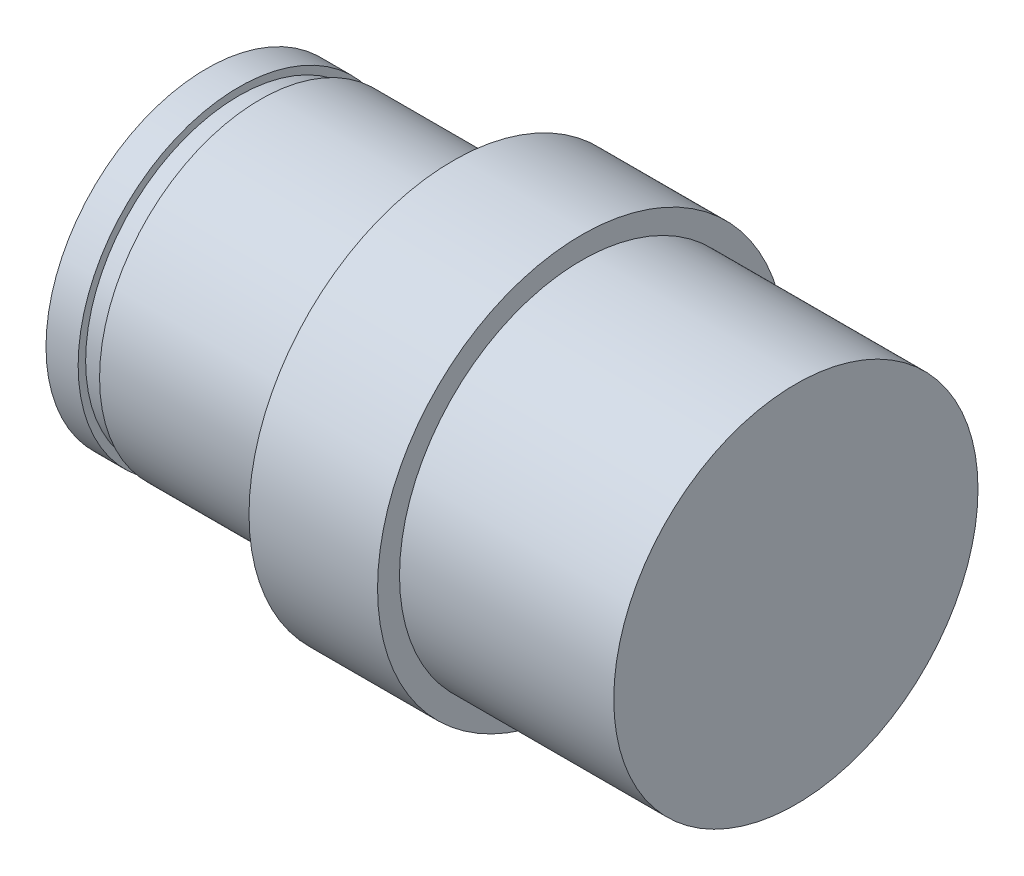
ISO-10303-21;
HEADER;
FILE_DESCRIPTION(('STEP AP214'),'2;1');
FILE_NAME('part.step','',(''),(''),'','','');
FILE_SCHEMA(('AUTOMOTIVE_DESIGN { 1 0 10303 214 1 1 1 1 }'));
ENDSEC;
DATA;
#1=APPLICATION_CONTEXT('core data for automotive mechanical design processes');
#2=APPLICATION_PROTOCOL_DEFINITION('international standard','automotive_design',2000,#1);
#3=PRODUCT_CONTEXT('',#1,'mechanical');
#4=PRODUCT('Part','Part','',(#3));
#5=PRODUCT_RELATED_PRODUCT_CATEGORY('part','',(#4));
#6=PRODUCT_DEFINITION_FORMATION('','',#4);
#7=PRODUCT_DEFINITION_CONTEXT('part definition',#1,'design');
#8=PRODUCT_DEFINITION('design','',#6,#7);
#9=PRODUCT_DEFINITION_SHAPE('','',#8);
#10=(LENGTH_UNIT() NAMED_UNIT(*) SI_UNIT(.MILLI.,.METRE.));
#11=(NAMED_UNIT(*) PLANE_ANGLE_UNIT() SI_UNIT($,.RADIAN.));
#12=(NAMED_UNIT(*) SI_UNIT($,.STERADIAN.) SOLID_ANGLE_UNIT());
#13=UNCERTAINTY_MEASURE_WITH_UNIT(LENGTH_MEASURE(1.E-05),#10,'distance_accuracy_value','');
#14=(GEOMETRIC_REPRESENTATION_CONTEXT(3) GLOBAL_UNCERTAINTY_ASSIGNED_CONTEXT((#13)) GLOBAL_UNIT_ASSIGNED_CONTEXT((#10,
#11,#12)) REPRESENTATION_CONTEXT('',''));
#15=CARTESIAN_POINT('',(0.,0.,0.));
#16=DIRECTION('',(0.,0.,1.));
#17=DIRECTION('',(1.,0.,0.));
#18=AXIS2_PLACEMENT_3D('',#15,#16,#17);
#19=CARTESIAN_POINT('',(0.,0.,0.));
#20=DIRECTION('',(-0.999999999999999,0.,0.));
#21=DIRECTION('',(0.,0.,1.));
#22=AXIS2_PLACEMENT_3D('',#19,#20,#21);
#23=CYLINDRICAL_SURFACE('',#22,7.5);
#24=CARTESIAN_POINT('',(11.5,0.,0.));
#25=DIRECTION('',(-0.999999999999999,0.,0.));
#26=DIRECTION('',(0.,0.,1.));
#27=AXIS2_PLACEMENT_3D('',#24,#25,#26);
#28=CIRCLE('',#27,7.5);
#29=CARTESIAN_POINT('',(11.5,0.,7.5));
#30=VERTEX_POINT('',#29);
#31=EDGE_CURVE('E37',#30,#30,#28,.T.);
#32=CARTESIAN_POINT('',(2.5,0.,0.));
#33=DIRECTION('',(-0.999999999999999,0.,0.));
#34=DIRECTION('',(0.,0.,1.));
#35=AXIS2_PLACEMENT_3D('',#32,#33,#34);
#36=CIRCLE('',#35,7.5);
#37=CARTESIAN_POINT('',(2.5,0.,7.5));
#38=VERTEX_POINT('',#37);
#39=EDGE_CURVE('E62',#38,#38,#36,.T.);
#40=CARTESIAN_POINT('',(11.5,0.,7.5));
#41=CARTESIAN_POINT('',(11.40625,0.,7.5));
#42=CARTESIAN_POINT('',(11.3125,0.,7.5));
#43=CARTESIAN_POINT('',(11.125,0.,7.5));
#44=CARTESIAN_POINT('',(11.03125,0.,7.5));
#45=CARTESIAN_POINT('',(10.84375,0.,7.5));
#46=CARTESIAN_POINT('',(10.75,0.,7.5));
#47=CARTESIAN_POINT('',(10.5625,0.,7.5));
#48=CARTESIAN_POINT('',(10.46875,0.,7.5));
#49=CARTESIAN_POINT('',(10.28125,0.,7.5));
#50=CARTESIAN_POINT('',(10.1875,0.,7.5));
#51=CARTESIAN_POINT('',(10.,0.,7.5));
#52=CARTESIAN_POINT('',(9.90625000000001,0.,7.5));
#53=CARTESIAN_POINT('',(9.71875000000001,0.,7.5));
#54=CARTESIAN_POINT('',(9.62500000000001,0.,7.5));
#55=CARTESIAN_POINT('',(9.43750000000001,0.,7.5));
#56=CARTESIAN_POINT('',(9.34375000000001,0.,7.5));
#57=CARTESIAN_POINT('',(9.15625000000001,0.,7.5));
#58=CARTESIAN_POINT('',(9.06250000000001,0.,7.5));
#59=CARTESIAN_POINT('',(8.87500000000001,0.,7.5));
#60=CARTESIAN_POINT('',(8.78125000000001,0.,7.5));
#61=CARTESIAN_POINT('',(8.59375000000001,0.,7.5));
#62=CARTESIAN_POINT('',(8.50000000000001,0.,7.5));
#63=CARTESIAN_POINT('',(8.31250000000001,0.,7.5));
#64=CARTESIAN_POINT('',(8.21875000000001,0.,7.5));
#65=CARTESIAN_POINT('',(8.03125000000001,0.,7.5));
#66=CARTESIAN_POINT('',(7.93750000000001,0.,7.5));
#67=CARTESIAN_POINT('',(7.75000000000001,0.,7.5));
#68=CARTESIAN_POINT('',(7.65625000000001,0.,7.5));
#69=CARTESIAN_POINT('',(7.46875000000001,0.,7.5));
#70=CARTESIAN_POINT('',(7.37500000000001,0.,7.5));
#71=CARTESIAN_POINT('',(7.18750000000001,0.,7.5));
#72=CARTESIAN_POINT('',(7.09375000000001,0.,7.5));
#73=CARTESIAN_POINT('',(6.90625000000001,0.,7.5));
#74=CARTESIAN_POINT('',(6.81250000000001,0.,7.5));
#75=CARTESIAN_POINT('',(6.62500000000001,0.,7.5));
#76=CARTESIAN_POINT('',(6.53125000000001,0.,7.5));
#77=CARTESIAN_POINT('',(6.34375000000001,0.,7.5));
#78=CARTESIAN_POINT('',(6.25,0.,7.5));
#79=CARTESIAN_POINT('',(6.0625,0.,7.5));
#80=CARTESIAN_POINT('',(5.96875,0.,7.5));
#81=CARTESIAN_POINT('',(5.78125,0.,7.5));
#82=CARTESIAN_POINT('',(5.68750000000001,0.,7.5));
#83=CARTESIAN_POINT('',(5.50000000000001,0.,7.5));
#84=CARTESIAN_POINT('',(5.40625,0.,7.5));
#85=CARTESIAN_POINT('',(5.21875,0.,7.5));
#86=CARTESIAN_POINT('',(5.125,0.,7.5));
#87=CARTESIAN_POINT('',(4.9375,0.,7.5));
#88=CARTESIAN_POINT('',(4.84375,0.,7.5));
#89=CARTESIAN_POINT('',(4.65625,0.,7.5));
#90=CARTESIAN_POINT('',(4.5625,0.,7.5));
#91=CARTESIAN_POINT('',(4.375,0.,7.5));
#92=CARTESIAN_POINT('',(4.28125,0.,7.5));
#93=CARTESIAN_POINT('',(4.09375,0.,7.5));
#94=CARTESIAN_POINT('',(4.,0.,7.5));
#95=CARTESIAN_POINT('',(3.8125,0.,7.5));
#96=CARTESIAN_POINT('',(3.71875,0.,7.5));
#97=CARTESIAN_POINT('',(3.53125,0.,7.5));
#98=CARTESIAN_POINT('',(3.4375,0.,7.5));
#99=CARTESIAN_POINT('',(3.25,0.,7.5));
#100=CARTESIAN_POINT('',(3.15625,0.,7.5));
#101=CARTESIAN_POINT('',(2.96875,0.,7.5));
#102=CARTESIAN_POINT('',(2.875,0.,7.5));
#103=CARTESIAN_POINT('',(2.6875,0.,7.5));
#104=CARTESIAN_POINT('',(2.59375,0.,7.5));
#105=CARTESIAN_POINT('',(2.5,0.,7.5));
#106=B_SPLINE_CURVE_WITH_KNOTS('',3,(#40,#41,#42,#43,#44,#45,#46,#47,#48,#49,#50,#51,#52,#53,
#54,#55,#56,#57,#58,#59,#60,#61,#62,#63,#64,#65,#66,#67,#68,#69,#70,#71,#72,#73,#74,#75,#76,#77,
#78,#79,#80,#81,#82,#83,#84,#85,#86,#87,#88,#89,#90,#91,#92,#93,#94,#95,#96,#97,#98,#99,#100,
#101,#102,#103,#104,#105),.UNSPECIFIED.,.F.,.F.,(4,2,2,2,2,2,2,2,2,2,2,2,2,2,2,2,2,2,2,2,2,2,2,
2,2,2,2,2,2,2,2,2,4),(0.,0.28125,0.5625,0.843750000000001,1.125,1.40625,1.6875,1.96875,2.25,
2.53125,2.8125,3.09375,3.375,3.65625,3.9375,4.21875,4.5,4.78125,5.0625,5.34375000000001,
5.62500000000001,5.90625000000001,6.18750000000001,6.46875000000001,6.75000000000001,
7.03125000000001,7.31250000000001,7.59375000000001,7.87500000000001,8.15625000000001,
8.43750000000001,8.71875000000001,9.00000000000001),.UNSPECIFIED.);
#107=EDGE_CURVE('BSEAM30',#30,#38,#106,.T.);
#108=ORIENTED_EDGE('',*,*,#31,.T.);
#109=ORIENTED_EDGE('',*,*,#39,.F.);
#110=ORIENTED_EDGE('',*,*,#107,.T.);
#111=ORIENTED_EDGE('',*,*,#107,.F.);
#112=EDGE_LOOP('',(#108,#110,#109,#111));
#113=FACE_BOUND('',#112,.T.);
#114=ADVANCED_FACE('F30',(#113),#23,.T.);
#115=CARTESIAN_POINT('',(11.5,7.5,0.));
#116=DIRECTION('',(0.999999999999999,0.,0.));
#117=DIRECTION('',(0.,0.,-1.));
#118=AXIS2_PLACEMENT_3D('',#115,#116,#117);
#119=PLANE('',#118);
#120=ORIENTED_EDGE('',*,*,#31,.F.);
#121=EDGE_LOOP('',(#120));
#122=FACE_BOUND('',#121,.T.);
#123=CARTESIAN_POINT('',(11.5,0.,0.));
#124=DIRECTION('',(-0.999999999999999,0.,0.));
#125=DIRECTION('',(0.,0.,1.));
#126=AXIS2_PLACEMENT_3D('',#123,#124,#125);
#127=CIRCLE('',#126,9.525);
#128=CARTESIAN_POINT('',(11.5,0.,9.525));
#129=VERTEX_POINT('',#128);
#130=EDGE_CURVE('E41',#129,#129,#127,.T.);
#131=ORIENTED_EDGE('',*,*,#130,.T.);
#132=EDGE_LOOP('',(#131));
#133=FACE_BOUND('',#132,.T.);
#134=ADVANCED_FACE('F88',(#122,#133),#119,.F.);
#135=CARTESIAN_POINT('',(0.,0.,0.));
#136=DIRECTION('',(-0.999999999999999,0.,0.));
#137=DIRECTION('',(0.,0.,1.));
#138=AXIS2_PLACEMENT_3D('',#135,#136,#137);
#139=CYLINDRICAL_SURFACE('',#138,9.525);
#140=CARTESIAN_POINT('',(17.5,0.,0.));
#141=DIRECTION('',(-0.999999999999999,0.,0.));
#142=DIRECTION('',(0.,0.,1.));
#143=AXIS2_PLACEMENT_3D('',#140,#141,#142);
#144=CIRCLE('',#143,9.525);
#145=CARTESIAN_POINT('',(17.5,0.,9.525));
#146=VERTEX_POINT('',#145);
#147=EDGE_CURVE('E45',#146,#146,#144,.T.);
#148=CARTESIAN_POINT('',(11.5,0.,9.525));
#149=CARTESIAN_POINT('',(11.5625,0.,9.525));
#150=CARTESIAN_POINT('',(11.625,0.,9.525));
#151=CARTESIAN_POINT('',(11.75,0.,9.525));
#152=CARTESIAN_POINT('',(11.8125,0.,9.525));
#153=CARTESIAN_POINT('',(11.9375,0.,9.525));
#154=CARTESIAN_POINT('',(12.,0.,9.525));
#155=CARTESIAN_POINT('',(12.125,0.,9.525));
#156=CARTESIAN_POINT('',(12.1875,0.,9.525));
#157=CARTESIAN_POINT('',(12.3125,0.,9.525));
#158=CARTESIAN_POINT('',(12.375,0.,9.525));
#159=CARTESIAN_POINT('',(12.5,0.,9.525));
#160=CARTESIAN_POINT('',(12.5625,0.,9.525));
#161=CARTESIAN_POINT('',(12.6875,0.,9.525));
#162=CARTESIAN_POINT('',(12.75,0.,9.525));
#163=CARTESIAN_POINT('',(12.875,0.,9.525));
#164=CARTESIAN_POINT('',(12.9375,0.,9.525));
#165=CARTESIAN_POINT('',(13.0625,0.,9.525));
#166=CARTESIAN_POINT('',(13.125,0.,9.525));
#167=CARTESIAN_POINT('',(13.25,0.,9.525));
#168=CARTESIAN_POINT('',(13.3125,0.,9.525));
#169=CARTESIAN_POINT('',(13.4375,0.,9.525));
#170=CARTESIAN_POINT('',(13.5,0.,9.525));
#171=CARTESIAN_POINT('',(13.625,0.,9.525));
#172=CARTESIAN_POINT('',(13.6875,0.,9.525));
#173=CARTESIAN_POINT('',(13.8125,0.,9.525));
#174=CARTESIAN_POINT('',(13.875,0.,9.525));
#175=CARTESIAN_POINT('',(14.,0.,9.525));
#176=CARTESIAN_POINT('',(14.0625,0.,9.525));
#177=CARTESIAN_POINT('',(14.1875,0.,9.525));
#178=CARTESIAN_POINT('',(14.25,0.,9.525));
#179=CARTESIAN_POINT('',(14.375,0.,9.525));
#180=CARTESIAN_POINT('',(14.4375,0.,9.525));
#181=CARTESIAN_POINT('',(14.5625,0.,9.525));
#182=CARTESIAN_POINT('',(14.625,0.,9.525));
#183=CARTESIAN_POINT('',(14.75,0.,9.525));
#184=CARTESIAN_POINT('',(14.8125,0.,9.525));
#185=CARTESIAN_POINT('',(14.9375,0.,9.525));
#186=CARTESIAN_POINT('',(15.,0.,9.525));
#187=CARTESIAN_POINT('',(15.125,0.,9.525));
#188=CARTESIAN_POINT('',(15.1875,0.,9.525));
#189=CARTESIAN_POINT('',(15.3125,0.,9.525));
#190=CARTESIAN_POINT('',(15.375,0.,9.525));
#191=CARTESIAN_POINT('',(15.5,0.,9.525));
#192=CARTESIAN_POINT('',(15.5625,0.,9.525));
#193=CARTESIAN_POINT('',(15.6875,0.,9.525));
#194=CARTESIAN_POINT('',(15.75,0.,9.525));
#195=CARTESIAN_POINT('',(15.875,0.,9.525));
#196=CARTESIAN_POINT('',(15.9375,0.,9.525));
#197=CARTESIAN_POINT('',(16.0625,0.,9.525));
#198=CARTESIAN_POINT('',(16.125,0.,9.525));
#199=CARTESIAN_POINT('',(16.25,0.,9.525));
#200=CARTESIAN_POINT('',(16.3125,0.,9.525));
#201=CARTESIAN_POINT('',(16.4375,0.,9.525));
#202=CARTESIAN_POINT('',(16.5,0.,9.525));
#203=CARTESIAN_POINT('',(16.625,0.,9.525));
#204=CARTESIAN_POINT('',(16.6875,0.,9.525));
#205=CARTESIAN_POINT('',(16.8125,0.,9.525));
#206=CARTESIAN_POINT('',(16.875,0.,9.525));
#207=CARTESIAN_POINT('',(17.,0.,9.525));
#208=CARTESIAN_POINT('',(17.0625,0.,9.525));
#209=CARTESIAN_POINT('',(17.1875,0.,9.525));
#210=CARTESIAN_POINT('',(17.25,0.,9.525));
#211=CARTESIAN_POINT('',(17.375,0.,9.525));
#212=CARTESIAN_POINT('',(17.4375,0.,9.525));
#213=CARTESIAN_POINT('',(17.5,0.,9.525));
#214=B_SPLINE_CURVE_WITH_KNOTS('',3,(#148,#149,#150,#151,#152,#153,#154,#155,#156,#157,#158,
#159,#160,#161,#162,#163,#164,#165,#166,#167,#168,#169,#170,#171,#172,#173,#174,#175,#176,#177,
#178,#179,#180,#181,#182,#183,#184,#185,#186,#187,#188,#189,#190,#191,#192,#193,#194,#195,#196,
#197,#198,#199,#200,#201,#202,#203,#204,#205,#206,#207,#208,#209,#210,#211,#212,#213),
.UNSPECIFIED.,.F.,.F.,(4,2,2,2,2,2,2,2,2,2,2,2,2,2,2,2,2,2,2,2,2,2,2,2,2,2,2,2,2,2,2,2,4),(0.,
0.1875,0.374999999999999,0.562499999999999,0.749999999999999,0.937499999999999,1.125,1.3125,1.5,
1.6875,1.875,2.0625,2.25,2.4375,2.625,2.8125,3.,3.1875,3.375,3.5625,3.75,3.9375,4.125,4.3125,
4.5,4.6875,4.875,5.0625,5.25,5.4375,5.625,5.8125,6.),.UNSPECIFIED.);
#215=EDGE_CURVE('BSEAM92',#129,#146,#214,.T.);
#216=ORIENTED_EDGE('',*,*,#130,.F.);
#217=ORIENTED_EDGE('',*,*,#147,.T.);
#218=ORIENTED_EDGE('',*,*,#215,.T.);
#219=ORIENTED_EDGE('',*,*,#215,.F.);
#220=EDGE_LOOP('',(#216,#218,#217,#219));
#221=FACE_BOUND('',#220,.T.);
#222=ADVANCED_FACE('F92',(#221),#139,.T.);
#223=CARTESIAN_POINT('',(17.5,9.525,0.));
#224=DIRECTION('',(-0.999999999999999,0.,0.));
#225=DIRECTION('',(0.,0.,1.));
#226=AXIS2_PLACEMENT_3D('',#223,#224,#225);
#227=PLANE('',#226);
#228=ORIENTED_EDGE('',*,*,#147,.F.);
#229=EDGE_LOOP('',(#228));
#230=FACE_BOUND('',#229,.T.);
#231=CARTESIAN_POINT('',(17.5,0.,0.));
#232=DIRECTION('',(-0.999999999999999,0.,0.));
#233=DIRECTION('',(0.,0.,1.));
#234=AXIS2_PLACEMENT_3D('',#231,#232,#233);
#235=CIRCLE('',#234,8.5);
#236=CARTESIAN_POINT('',(17.5,0.,8.5));
#237=VERTEX_POINT('',#236);
#238=EDGE_CURVE('E50',#237,#237,#235,.T.);
#239=ORIENTED_EDGE('',*,*,#238,.T.);
#240=EDGE_LOOP('',(#239));
#241=FACE_BOUND('',#240,.T.);
#242=ADVANCED_FACE('F138',(#230,#241),#227,.F.);
#243=CARTESIAN_POINT('',(0.,0.,0.));
#244=DIRECTION('',(-0.999999999999999,0.,0.));
#245=DIRECTION('',(0.,0.,1.));
#246=AXIS2_PLACEMENT_3D('',#243,#244,#245);
#247=CYLINDRICAL_SURFACE('',#246,8.5);
#248=CARTESIAN_POINT('',(27.5,0.,0.));
#249=DIRECTION('',(-0.999999999999999,0.,0.));
#250=DIRECTION('',(0.,0.,1.));
#251=AXIS2_PLACEMENT_3D('',#248,#249,#250);
#252=CIRCLE('',#251,8.5);
#253=CARTESIAN_POINT('',(27.5,0.,8.5));
#254=VERTEX_POINT('',#253);
#255=EDGE_CURVE('E53',#254,#254,#252,.T.);
#256=CARTESIAN_POINT('',(17.5,0.,8.5));
#257=CARTESIAN_POINT('',(17.6041666666667,0.,8.5));
#258=CARTESIAN_POINT('',(17.7083333333333,0.,8.5));
#259=CARTESIAN_POINT('',(17.9166666666667,0.,8.5));
#260=CARTESIAN_POINT('',(18.0208333333333,0.,8.5));
#261=CARTESIAN_POINT('',(18.2291666666667,0.,8.5));
#262=CARTESIAN_POINT('',(18.3333333333333,0.,8.5));
#263=CARTESIAN_POINT('',(18.5416666666667,0.,8.5));
#264=CARTESIAN_POINT('',(18.6458333333333,0.,8.5));
#265=CARTESIAN_POINT('',(18.8541666666667,0.,8.5));
#266=CARTESIAN_POINT('',(18.9583333333333,0.,8.5));
#267=CARTESIAN_POINT('',(19.1666666666667,0.,8.5));
#268=CARTESIAN_POINT('',(19.2708333333333,0.,8.5));
#269=CARTESIAN_POINT('',(19.4791666666667,0.,8.5));
#270=CARTESIAN_POINT('',(19.5833333333333,0.,8.5));
#271=CARTESIAN_POINT('',(19.7916666666667,0.,8.5));
#272=CARTESIAN_POINT('',(19.8958333333333,0.,8.5));
#273=CARTESIAN_POINT('',(20.1041666666667,0.,8.5));
#274=CARTESIAN_POINT('',(20.2083333333333,0.,8.5));
#275=CARTESIAN_POINT('',(20.4166666666667,0.,8.5));
#276=CARTESIAN_POINT('',(20.5208333333333,0.,8.5));
#277=CARTESIAN_POINT('',(20.7291666666667,0.,8.5));
#278=CARTESIAN_POINT('',(20.8333333333333,0.,8.5));
#279=CARTESIAN_POINT('',(21.0416666666667,0.,8.5));
#280=CARTESIAN_POINT('',(21.1458333333333,0.,8.5));
#281=CARTESIAN_POINT('',(21.3541666666667,0.,8.5));
#282=CARTESIAN_POINT('',(21.4583333333333,0.,8.5));
#283=CARTESIAN_POINT('',(21.6666666666667,0.,8.5));
#284=CARTESIAN_POINT('',(21.7708333333333,0.,8.5));
#285=CARTESIAN_POINT('',(21.9791666666667,0.,8.5));
#286=CARTESIAN_POINT('',(22.0833333333333,0.,8.5));
#287=CARTESIAN_POINT('',(22.2916666666667,0.,8.5));
#288=CARTESIAN_POINT('',(22.3958333333333,0.,8.5));
#289=CARTESIAN_POINT('',(22.6041666666667,0.,8.5));
#290=CARTESIAN_POINT('',(22.7083333333333,0.,8.5));
#291=CARTESIAN_POINT('',(22.9166666666667,0.,8.5));
#292=CARTESIAN_POINT('',(23.0208333333333,0.,8.5));
#293=CARTESIAN_POINT('',(23.2291666666667,0.,8.5));
#294=CARTESIAN_POINT('',(23.3333333333333,0.,8.5));
#295=CARTESIAN_POINT('',(23.5416666666667,0.,8.5));
#296=CARTESIAN_POINT('',(23.6458333333333,0.,8.5));
#297=CARTESIAN_POINT('',(23.8541666666667,0.,8.5));
#298=CARTESIAN_POINT('',(23.9583333333333,0.,8.5));
#299=CARTESIAN_POINT('',(24.1666666666667,0.,8.5));
#300=CARTESIAN_POINT('',(24.2708333333333,0.,8.5));
#301=CARTESIAN_POINT('',(24.4791666666667,0.,8.5));
#302=CARTESIAN_POINT('',(24.5833333333334,0.,8.5));
#303=CARTESIAN_POINT('',(24.7916666666667,0.,8.5));
#304=CARTESIAN_POINT('',(24.8958333333334,0.,8.5));
#305=CARTESIAN_POINT('',(25.1041666666667,0.,8.5));
#306=CARTESIAN_POINT('',(25.2083333333334,0.,8.5));
#307=CARTESIAN_POINT('',(25.4166666666667,0.,8.5));
#308=CARTESIAN_POINT('',(25.5208333333334,0.,8.5));
#309=CARTESIAN_POINT('',(25.7291666666667,0.,8.5));
#310=CARTESIAN_POINT('',(25.8333333333334,0.,8.5));
#311=CARTESIAN_POINT('',(26.0416666666667,0.,8.5));
#312=CARTESIAN_POINT('',(26.1458333333334,0.,8.5));
#313=CARTESIAN_POINT('',(26.3541666666667,0.,8.5));
#314=CARTESIAN_POINT('',(26.4583333333334,0.,8.5));
#315=CARTESIAN_POINT('',(26.6666666666667,0.,8.5));
#316=CARTESIAN_POINT('',(26.7708333333334,0.,8.5));
#317=CARTESIAN_POINT('',(26.9791666666667,0.,8.5));
#318=CARTESIAN_POINT('',(27.0833333333334,0.,8.5));
#319=CARTESIAN_POINT('',(27.2916666666667,0.,8.5));
#320=CARTESIAN_POINT('',(27.3958333333334,0.,8.5));
#321=CARTESIAN_POINT('',(27.5,0.,8.5));
#322=B_SPLINE_CURVE_WITH_KNOTS('',3,(#256,#257,#258,#259,#260,#261,#262,#263,#264,#265,#266,
#267,#268,#269,#270,#271,#272,#273,#274,#275,#276,#277,#278,#279,#280,#281,#282,#283,#284,#285,
#286,#287,#288,#289,#290,#291,#292,#293,#294,#295,#296,#297,#298,#299,#300,#301,#302,#303,#304,
#305,#306,#307,#308,#309,#310,#311,#312,#313,#314,#315,#316,#317,#318,#319,#320,#321),
.UNSPECIFIED.,.F.,.F.,(4,2,2,2,2,2,2,2,2,2,2,2,2,2,2,2,2,2,2,2,2,2,2,2,2,2,2,2,2,2,2,2,4),(0.,
0.3125,0.625000000000001,0.937499999999997,1.25,1.5625,1.875,2.1875,2.5,2.8125,3.125,3.4375,
3.75,4.0625,4.375,4.6875,5.,5.3125,5.62500000000001,5.9375,6.25,6.5625,6.87500000000001,
7.18750000000001,7.50000000000001,7.81250000000001,8.12500000000001,8.43750000000001,
8.75000000000001,9.06250000000001,9.37500000000001,9.68750000000001,10.),.UNSPECIFIED.);
#323=EDGE_CURVE('BSEAM84',#237,#254,#322,.T.);
#324=ORIENTED_EDGE('',*,*,#238,.F.);
#325=ORIENTED_EDGE('',*,*,#255,.T.);
#326=ORIENTED_EDGE('',*,*,#323,.T.);
#327=ORIENTED_EDGE('',*,*,#323,.F.);
#328=EDGE_LOOP('',(#324,#326,#325,#327));
#329=FACE_BOUND('',#328,.T.);
#330=ADVANCED_FACE('F84',(#329),#247,.T.);
#331=CARTESIAN_POINT('',(27.5,8.5,0.));
#332=DIRECTION('',(-0.999999999999999,0.,0.));
#333=DIRECTION('',(0.,0.,1.));
#334=AXIS2_PLACEMENT_3D('',#331,#332,#333);
#335=PLANE('',#334);
#336=ORIENTED_EDGE('',*,*,#255,.F.);
#337=EDGE_LOOP('',(#336));
#338=FACE_BOUND('',#337,.T.);
#339=ADVANCED_FACE('F74',(#338),#335,.F.);
#340=CARTESIAN_POINT('',(1.5,7.50000000000001,0.));
#341=DIRECTION('',(0.999999999999999,0.,0.));
#342=DIRECTION('',(0.,0.,-1.));
#343=AXIS2_PLACEMENT_3D('',#340,#341,#342);
#344=PLANE('',#343);
#345=CARTESIAN_POINT('',(1.5,0.,0.));
#346=DIRECTION('',(-0.999999999999999,0.,0.));
#347=DIRECTION('',(0.,0.,1.));
#348=AXIS2_PLACEMENT_3D('',#345,#346,#347);
#349=CIRCLE('',#348,7.15);
#350=CARTESIAN_POINT('',(1.5,0.,7.15));
#351=VERTEX_POINT('',#350);
#352=EDGE_CURVE('E56',#351,#351,#349,.T.);
#353=ORIENTED_EDGE('',*,*,#352,.T.);
#354=EDGE_LOOP('',(#353));
#355=FACE_BOUND('',#354,.T.);
#356=CARTESIAN_POINT('',(1.5,0.,0.));
#357=DIRECTION('',(-0.999999999999999,0.,0.));
#358=DIRECTION('',(0.,0.,1.));
#359=AXIS2_PLACEMENT_3D('',#356,#357,#358);
#360=CIRCLE('',#359,7.5);
#361=CARTESIAN_POINT('',(1.5,0.,7.5));
#362=VERTEX_POINT('',#361);
#363=EDGE_CURVE('E65',#362,#362,#360,.T.);
#364=ORIENTED_EDGE('',*,*,#363,.F.);
#365=EDGE_LOOP('',(#364));
#366=FACE_BOUND('',#365,.T.);
#367=ADVANCED_FACE('F71',(#355,#366),#344,.T.);
#368=CARTESIAN_POINT('',(0.,0.,0.));
#369=DIRECTION('',(-0.999999999999999,0.,0.));
#370=DIRECTION('',(0.,0.,1.));
#371=AXIS2_PLACEMENT_3D('',#368,#369,#370);
#372=CYLINDRICAL_SURFACE('',#371,7.15);
#373=CARTESIAN_POINT('',(2.5,0.,0.));
#374=DIRECTION('',(-0.999999999999999,0.,0.));
#375=DIRECTION('',(0.,0.,1.));
#376=AXIS2_PLACEMENT_3D('',#373,#374,#375);
#377=CIRCLE('',#376,7.15);
#378=CARTESIAN_POINT('',(2.5,0.,7.15));
#379=VERTEX_POINT('',#378);
#380=EDGE_CURVE('E59',#379,#379,#377,.T.);
#381=CARTESIAN_POINT('',(2.5,0.,7.15));
#382=CARTESIAN_POINT('',(2.48958333333334,0.,7.15));
#383=CARTESIAN_POINT('',(2.47916666666667,0.,7.15));
#384=CARTESIAN_POINT('',(2.45833333333334,0.,7.15));
#385=CARTESIAN_POINT('',(2.44791666666667,0.,7.15));
#386=CARTESIAN_POINT('',(2.42708333333334,0.,7.15));
#387=CARTESIAN_POINT('',(2.41666666666667,0.,7.15));
#388=CARTESIAN_POINT('',(2.39583333333334,0.,7.15));
#389=CARTESIAN_POINT('',(2.38541666666667,0.,7.15));
#390=CARTESIAN_POINT('',(2.36458333333334,0.,7.15));
#391=CARTESIAN_POINT('',(2.35416666666667,0.,7.15));
#392=CARTESIAN_POINT('',(2.33333333333334,0.,7.15));
#393=CARTESIAN_POINT('',(2.32291666666667,0.,7.15));
#394=CARTESIAN_POINT('',(2.30208333333334,0.,7.15));
#395=CARTESIAN_POINT('',(2.29166666666667,0.,7.15));
#396=CARTESIAN_POINT('',(2.27083333333334,0.,7.15));
#397=CARTESIAN_POINT('',(2.26041666666667,0.,7.15));
#398=CARTESIAN_POINT('',(2.23958333333334,0.,7.15));
#399=CARTESIAN_POINT('',(2.22916666666667,0.,7.15));
#400=CARTESIAN_POINT('',(2.20833333333334,0.,7.15));
#401=CARTESIAN_POINT('',(2.19791666666667,0.,7.15));
#402=CARTESIAN_POINT('',(2.17708333333334,0.,7.15));
#403=CARTESIAN_POINT('',(2.16666666666667,0.,7.15));
#404=CARTESIAN_POINT('',(2.14583333333334,0.,7.15));
#405=CARTESIAN_POINT('',(2.13541666666667,0.,7.15));
#406=CARTESIAN_POINT('',(2.11458333333334,0.,7.15));
#407=CARTESIAN_POINT('',(2.10416666666667,0.,7.15));
#408=CARTESIAN_POINT('',(2.08333333333334,0.,7.15));
#409=CARTESIAN_POINT('',(2.07291666666667,0.,7.15));
#410=CARTESIAN_POINT('',(2.05208333333333,0.,7.15));
#411=CARTESIAN_POINT('',(2.04166666666667,0.,7.15));
#412=CARTESIAN_POINT('',(2.02083333333333,0.,7.15));
#413=CARTESIAN_POINT('',(2.01041666666667,0.,7.15));
#414=CARTESIAN_POINT('',(1.98958333333334,0.,7.15));
#415=CARTESIAN_POINT('',(1.97916666666667,0.,7.15));
#416=CARTESIAN_POINT('',(1.95833333333334,0.,7.15));
#417=CARTESIAN_POINT('',(1.94791666666667,0.,7.15));
#418=CARTESIAN_POINT('',(1.92708333333334,0.,7.15));
#419=CARTESIAN_POINT('',(1.91666666666667,0.,7.15));
#420=CARTESIAN_POINT('',(1.89583333333334,0.,7.15));
#421=CARTESIAN_POINT('',(1.88541666666667,0.,7.15));
#422=CARTESIAN_POINT('',(1.86458333333334,0.,7.15));
#423=CARTESIAN_POINT('',(1.85416666666667,0.,7.15));
#424=CARTESIAN_POINT('',(1.83333333333333,0.,7.15));
#425=CARTESIAN_POINT('',(1.82291666666667,0.,7.15));
#426=CARTESIAN_POINT('',(1.80208333333333,0.,7.15));
#427=CARTESIAN_POINT('',(1.79166666666667,0.,7.15));
#428=CARTESIAN_POINT('',(1.77083333333334,0.,7.15));
#429=CARTESIAN_POINT('',(1.76041666666667,0.,7.15));
#430=CARTESIAN_POINT('',(1.73958333333334,0.,7.15));
#431=CARTESIAN_POINT('',(1.72916666666667,0.,7.15));
#432=CARTESIAN_POINT('',(1.70833333333333,0.,7.15));
#433=CARTESIAN_POINT('',(1.69791666666667,0.,7.15));
#434=CARTESIAN_POINT('',(1.67708333333333,0.,7.15));
#435=CARTESIAN_POINT('',(1.66666666666667,0.,7.15));
#436=CARTESIAN_POINT('',(1.64583333333333,0.,7.15));
#437=CARTESIAN_POINT('',(1.63541666666667,0.,7.15));
#438=CARTESIAN_POINT('',(1.61458333333333,0.,7.15));
#439=CARTESIAN_POINT('',(1.60416666666667,0.,7.15));
#440=CARTESIAN_POINT('',(1.58333333333333,0.,7.15));
#441=CARTESIAN_POINT('',(1.57291666666667,0.,7.15));
#442=CARTESIAN_POINT('',(1.55208333333333,0.,7.15));
#443=CARTESIAN_POINT('',(1.54166666666667,0.,7.15));
#444=CARTESIAN_POINT('',(1.52083333333333,0.,7.15));
#445=CARTESIAN_POINT('',(1.51041666666667,0.,7.15));
#446=CARTESIAN_POINT('',(1.5,0.,7.15));
#447=B_SPLINE_CURVE_WITH_KNOTS('',3,(#381,#382,#383,#384,#385,#386,#387,#388,#389,#390,#391,
#392,#393,#394,#395,#396,#397,#398,#399,#400,#401,#402,#403,#404,#405,#406,#407,#408,#409,#410,
#411,#412,#413,#414,#415,#416,#417,#418,#419,#420,#421,#422,#423,#424,#425,#426,#427,#428,#429,
#430,#431,#432,#433,#434,#435,#436,#437,#438,#439,#440,#441,#442,#443,#444,#445,#446),
.UNSPECIFIED.,.F.,.F.,(4,2,2,2,2,2,2,2,2,2,2,2,2,2,2,2,2,2,2,2,2,2,2,2,2,2,2,2,2,2,2,2,4),(0.,
0.03125,0.0625000000000001,0.0937500000000001,0.125,0.15625,0.1875,0.21875,0.25,0.28125,0.3125,
0.34375,0.375,0.40625,0.4375,0.46875,0.5,0.53125,0.5625,0.593750000000001,0.625000000000001,
0.656250000000001,0.687500000000001,0.718750000000001,0.750000000000001,0.781250000000001,
0.812500000000001,0.843750000000001,0.875000000000001,0.906250000000001,0.937500000000001,
0.968750000000001,1.),.UNSPECIFIED.);
#448=EDGE_CURVE('BSEAM73',#379,#351,#447,.T.);
#449=ORIENTED_EDGE('',*,*,#380,.T.);
#450=ORIENTED_EDGE('',*,*,#352,.F.);
#451=ORIENTED_EDGE('',*,*,#448,.T.);
#452=ORIENTED_EDGE('',*,*,#448,.F.);
#453=EDGE_LOOP('',(#449,#451,#450,#452));
#454=FACE_BOUND('',#453,.T.);
#455=ADVANCED_FACE('F73',(#454),#372,.T.);
#456=CARTESIAN_POINT('',(2.5,7.5,0.));
#457=DIRECTION('',(-0.999999999999999,0.,0.));
#458=DIRECTION('',(0.,0.,1.));
#459=AXIS2_PLACEMENT_3D('',#456,#457,#458);
#460=PLANE('',#459);
#461=ORIENTED_EDGE('',*,*,#39,.T.);
#462=EDGE_LOOP('',(#461));
#463=FACE_BOUND('',#462,.T.);
#464=ORIENTED_EDGE('',*,*,#380,.F.);
#465=EDGE_LOOP('',(#464));
#466=FACE_BOUND('',#465,.T.);
#467=ADVANCED_FACE('F81',(#463,#466),#460,.T.);
#468=CARTESIAN_POINT('',(0.,0.,0.));
#469=DIRECTION('',(0.999999999999999,0.,0.));
#470=DIRECTION('',(0.,0.,-1.));
#471=AXIS2_PLACEMENT_3D('',#468,#469,#470);
#472=PLANE('',#471);
#473=CARTESIAN_POINT('',(0.,0.,0.));
#474=DIRECTION('',(-0.999999999999999,0.,0.));
#475=DIRECTION('',(0.,0.,1.));
#476=AXIS2_PLACEMENT_3D('',#473,#474,#475);
#477=CIRCLE('',#476,7.5);
#478=CARTESIAN_POINT('',(0.,0.,7.5));
#479=VERTEX_POINT('',#478);
#480=EDGE_CURVE('E10',#479,#479,#477,.T.);
#481=ORIENTED_EDGE('',*,*,#480,.T.);
#482=EDGE_LOOP('',(#481));
#483=FACE_BOUND('',#482,.T.);
#484=ADVANCED_FACE('F32',(#483),#472,.F.);
#485=CARTESIAN_POINT('',(0.,0.,7.5));
#486=CARTESIAN_POINT('',(0.015625,0.,7.5));
#487=CARTESIAN_POINT('',(0.03125,0.,7.5));
#488=CARTESIAN_POINT('',(0.0625,0.,7.5));
#489=CARTESIAN_POINT('',(0.0781250000000001,0.,7.5));
#490=CARTESIAN_POINT('',(0.109375,0.,7.5));
#491=CARTESIAN_POINT('',(0.125,0.,7.5));
#492=CARTESIAN_POINT('',(0.15625,0.,7.5));
#493=CARTESIAN_POINT('',(0.171875,0.,7.5));
#494=CARTESIAN_POINT('',(0.203125,0.,7.5));
#495=CARTESIAN_POINT('',(0.21875,0.,7.5));
#496=CARTESIAN_POINT('',(0.25,0.,7.5));
#497=CARTESIAN_POINT('',(0.265625,0.,7.5));
#498=CARTESIAN_POINT('',(0.296875,0.,7.5));
#499=CARTESIAN_POINT('',(0.3125,0.,7.5));
#500=CARTESIAN_POINT('',(0.34375,0.,7.5));
#501=CARTESIAN_POINT('',(0.359375,0.,7.5));
#502=CARTESIAN_POINT('',(0.390625,0.,7.5));
#503=CARTESIAN_POINT('',(0.40625,0.,7.5));
#504=CARTESIAN_POINT('',(0.4375,0.,7.5));
#505=CARTESIAN_POINT('',(0.453125,0.,7.5));
#506=CARTESIAN_POINT('',(0.484375,0.,7.5));
#507=CARTESIAN_POINT('',(0.5,0.,7.5));
#508=CARTESIAN_POINT('',(0.53125,0.,7.5));
#509=CARTESIAN_POINT('',(0.546875,0.,7.5));
#510=CARTESIAN_POINT('',(0.578125000000001,0.,7.5));
#511=CARTESIAN_POINT('',(0.59375,0.,7.5));
#512=CARTESIAN_POINT('',(0.625,0.,7.5));
#513=CARTESIAN_POINT('',(0.640625000000001,0.,7.5));
#514=CARTESIAN_POINT('',(0.671875000000001,0.,7.5));
#515=CARTESIAN_POINT('',(0.687500000000001,0.,7.5));
#516=CARTESIAN_POINT('',(0.718750000000001,0.,7.5));
#517=CARTESIAN_POINT('',(0.734375000000001,0.,7.5));
#518=CARTESIAN_POINT('',(0.765625000000001,0.,7.5));
#519=CARTESIAN_POINT('',(0.781250000000001,0.,7.5));
#520=CARTESIAN_POINT('',(0.812500000000001,0.,7.5));
#521=CARTESIAN_POINT('',(0.828125000000001,0.,7.5));
#522=CARTESIAN_POINT('',(0.859375000000001,0.,7.5));
#523=CARTESIAN_POINT('',(0.875000000000001,0.,7.5));
#524=CARTESIAN_POINT('',(0.906250000000001,0.,7.5));
#525=CARTESIAN_POINT('',(0.921875000000001,0.,7.5));
#526=CARTESIAN_POINT('',(0.953125000000001,0.,7.5));
#527=CARTESIAN_POINT('',(0.968750000000001,0.,7.5));
#528=CARTESIAN_POINT('',(1.,0.,7.5));
#529=CARTESIAN_POINT('',(1.015625,0.,7.5));
#530=CARTESIAN_POINT('',(1.046875,0.,7.5));
#531=CARTESIAN_POINT('',(1.0625,0.,7.5));
#532=CARTESIAN_POINT('',(1.09375,0.,7.5));
#533=CARTESIAN_POINT('',(1.109375,0.,7.5));
#534=CARTESIAN_POINT('',(1.140625,0.,7.5));
#535=CARTESIAN_POINT('',(1.15625,0.,7.5));
#536=CARTESIAN_POINT('',(1.1875,0.,7.5));
#537=CARTESIAN_POINT('',(1.203125,0.,7.5));
#538=CARTESIAN_POINT('',(1.234375,0.,7.5));
#539=CARTESIAN_POINT('',(1.25,0.,7.5));
#540=CARTESIAN_POINT('',(1.28125,0.,7.5));
#541=CARTESIAN_POINT('',(1.296875,0.,7.5));
#542=CARTESIAN_POINT('',(1.328125,0.,7.5));
#543=CARTESIAN_POINT('',(1.34375,0.,7.5));
#544=CARTESIAN_POINT('',(1.375,0.,7.5));
#545=CARTESIAN_POINT('',(1.390625,0.,7.5));
#546=CARTESIAN_POINT('',(1.421875,0.,7.5));
#547=CARTESIAN_POINT('',(1.4375,0.,7.5));
#548=CARTESIAN_POINT('',(1.46875,0.,7.5));
#549=CARTESIAN_POINT('',(1.484375,0.,7.5));
#550=CARTESIAN_POINT('',(1.5,0.,7.5));
#551=B_SPLINE_CURVE_WITH_KNOTS('',3,(#485,#486,#487,#488,#489,#490,#491,#492,#493,#494,#495,
#496,#497,#498,#499,#500,#501,#502,#503,#504,#505,#506,#507,#508,#509,#510,#511,#512,#513,#514,
#515,#516,#517,#518,#519,#520,#521,#522,#523,#524,#525,#526,#527,#528,#529,#530,#531,#532,#533,
#534,#535,#536,#537,#538,#539,#540,#541,#542,#543,#544,#545,#546,#547,#548,#549,#550),
.UNSPECIFIED.,.F.,.F.,(4,2,2,2,2,2,2,2,2,2,2,2,2,2,2,2,2,2,2,2,2,2,2,2,2,2,2,2,2,2,2,2,4),(0.,
0.046875,0.0937500000000001,0.140625,0.1875,0.234375,0.28125,0.328125,0.375,0.421875,0.46875,
0.515625,0.5625,0.609375,0.656250000000001,0.703125000000001,0.750000000000001,
0.796875000000001,0.843750000000001,0.890625000000001,0.937500000000001,0.984375000000001,
1.03125,1.078125,1.125,1.171875,1.21875,1.265625,1.3125,1.359375,1.40625,1.453125,1.5),.UNSPECIFIED.);
#552=EDGE_CURVE('BSEAM69',#479,#362,#551,.T.);
#553=ORIENTED_EDGE('',*,*,#480,.F.);
#554=ORIENTED_EDGE('',*,*,#363,.T.);
#555=ORIENTED_EDGE('',*,*,#552,.T.);
#556=ORIENTED_EDGE('',*,*,#552,.F.);
#557=EDGE_LOOP('',(#553,#555,#554,#556));
#558=FACE_BOUND('',#557,.T.);
#559=ADVANCED_FACE('F69',(#558),#23,.T.);
#560=CLOSED_SHELL('',(#114,#134,#222,#242,#330,#339,#367,#455,#467,#484,#559));
#561=MANIFOLD_SOLID_BREP('B2',#560);
#562=ADVANCED_BREP_SHAPE_REPRESENTATION('',(#18,#561),#14);
#563=SHAPE_DEFINITION_REPRESENTATION(#9,#562);
ENDSEC;
END-ISO-10303-21;
